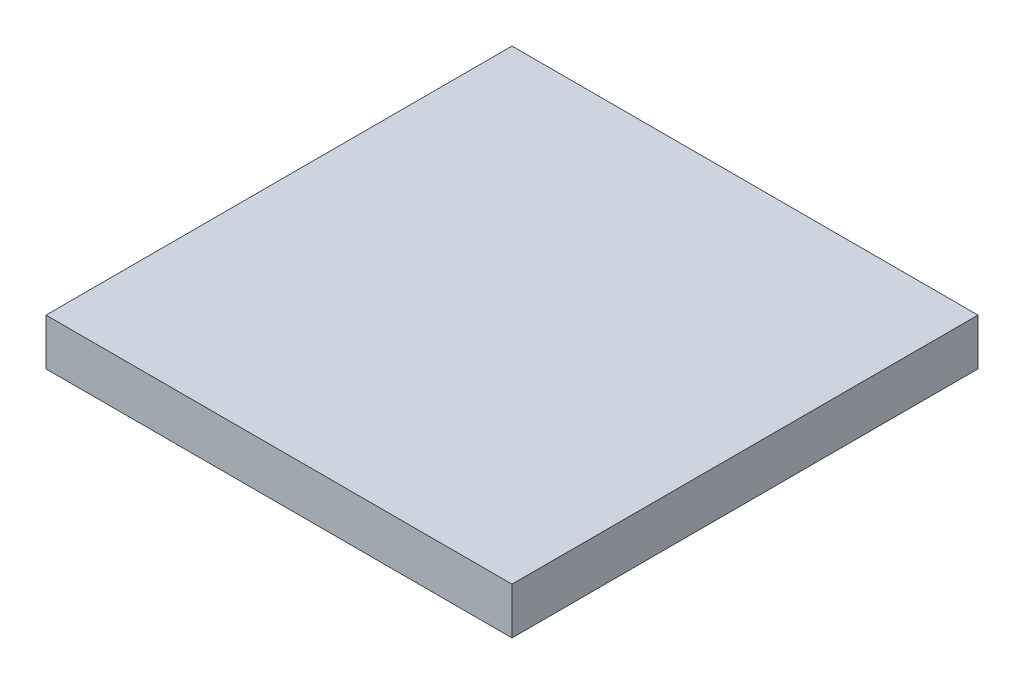
ISO-10303-21;
HEADER;
FILE_DESCRIPTION(('STEP AP214'),'2;1');
FILE_NAME('part.step','',(''),(''),'','','');
FILE_SCHEMA(('AUTOMOTIVE_DESIGN { 1 0 10303 214 1 1 1 1 }'));
ENDSEC;
DATA;
#1=APPLICATION_CONTEXT('core data for automotive mechanical design processes');
#2=APPLICATION_PROTOCOL_DEFINITION('international standard','automotive_design',2000,#1);
#3=PRODUCT_CONTEXT('',#1,'mechanical');
#4=PRODUCT('Part','Part','',(#3));
#5=PRODUCT_RELATED_PRODUCT_CATEGORY('part','',(#4));
#6=PRODUCT_DEFINITION_FORMATION('','',#4);
#7=PRODUCT_DEFINITION_CONTEXT('part definition',#1,'design');
#8=PRODUCT_DEFINITION('design','',#6,#7);
#9=PRODUCT_DEFINITION_SHAPE('','',#8);
#10=(LENGTH_UNIT() NAMED_UNIT(*) SI_UNIT(.MILLI.,.METRE.));
#11=(NAMED_UNIT(*) PLANE_ANGLE_UNIT() SI_UNIT($,.RADIAN.));
#12=(NAMED_UNIT(*) SI_UNIT($,.STERADIAN.) SOLID_ANGLE_UNIT());
#13=UNCERTAINTY_MEASURE_WITH_UNIT(LENGTH_MEASURE(1.E-05),#10,'distance_accuracy_value','');
#14=(GEOMETRIC_REPRESENTATION_CONTEXT(3) GLOBAL_UNCERTAINTY_ASSIGNED_CONTEXT((#13)) GLOBAL_UNIT_ASSIGNED_CONTEXT((#10,
#11,#12)) REPRESENTATION_CONTEXT('',''));
#15=CARTESIAN_POINT('',(0.,0.,0.));
#16=DIRECTION('',(0.,0.,1.));
#17=DIRECTION('',(1.,0.,0.));
#18=AXIS2_PLACEMENT_3D('',#15,#16,#17);
#19=CARTESIAN_POINT('',(-46.3511003257975,20.,-218.347310545628));
#20=DIRECTION('',(1.,0.,0.));
#21=DIRECTION('',(0.,0.,-1.));
#22=AXIS2_PLACEMENT_3D('',#19,#20,#21);
#23=PLANE('',#22);
#24=DIRECTION('',(0.,0.,1.));
#25=VECTOR('',#24,1.);
#26=CARTESIAN_POINT('',(-46.3511003257975,0.,-218.347310545628));
#27=LINE('',#26,#25);
#28=CARTESIAN_POINT('',(-46.3511003257975,0.,-218.347310545628));
#29=VERTEX_POINT('',#28);
#30=CARTESIAN_POINT('',(-46.3511003257975,0.,-18.3473105456282));
#31=VERTEX_POINT('',#30);
#32=EDGE_CURVE('E96',#29,#31,#27,.T.);
#33=ORIENTED_EDGE('',*,*,#32,.T.);
#34=DIRECTION('',(0.,-1.,0.));
#35=VECTOR('',#34,1.);
#36=CARTESIAN_POINT('',(-46.3511003257975,20.,-18.3473105456282));
#37=LINE('',#36,#35);
#38=CARTESIAN_POINT('',(-46.3511003257975,20.,-18.3473105456282));
#39=VERTEX_POINT('',#38);
#40=EDGE_CURVE('E11',#39,#31,#37,.T.);
#41=ORIENTED_EDGE('',*,*,#40,.F.);
#42=DIRECTION('',(0.,0.,1.));
#43=VECTOR('',#42,1.);
#44=CARTESIAN_POINT('',(-46.3511003257975,20.,-218.347310545628));
#45=LINE('',#44,#43);
#46=CARTESIAN_POINT('',(-46.3511003257975,20.,-218.347310545628));
#47=VERTEX_POINT('',#46);
#48=EDGE_CURVE('E84',#47,#39,#45,.T.);
#49=ORIENTED_EDGE('',*,*,#48,.F.);
#50=DIRECTION('',(0.,-1.,0.));
#51=VECTOR('',#50,1.);
#52=CARTESIAN_POINT('',(-46.3511003257975,20.,-218.347310545628));
#53=LINE('',#52,#51);
#54=EDGE_CURVE('E92',#47,#29,#53,.T.);
#55=ORIENTED_EDGE('',*,*,#54,.T.);
#56=EDGE_LOOP('',(#33,#41,#49,#55));
#57=FACE_BOUND('',#56,.T.);
#58=ADVANCED_FACE('F33',(#57),#23,.F.);
#59=CARTESIAN_POINT('',(-46.3511003257975,20.,-18.3473105456282));
#60=DIRECTION('',(0.,0.,-1.));
#61=DIRECTION('',(-1.,0.,0.));
#62=AXIS2_PLACEMENT_3D('',#59,#60,#61);
#63=PLANE('',#62);
#64=DIRECTION('',(1.,0.,0.));
#65=VECTOR('',#64,1.);
#66=CARTESIAN_POINT('',(-46.3511003257975,0.,-18.3473105456282));
#67=LINE('',#66,#65);
#68=CARTESIAN_POINT('',(153.648899674203,0.,-18.3473105456282));
#69=VERTEX_POINT('',#68);
#70=EDGE_CURVE('E88',#31,#69,#67,.T.);
#71=ORIENTED_EDGE('',*,*,#70,.T.);
#72=DIRECTION('',(0.,-1.,0.));
#73=VECTOR('',#72,1.);
#74=CARTESIAN_POINT('',(153.648899674203,20.,-18.3473105456282));
#75=LINE('',#74,#73);
#76=CARTESIAN_POINT('',(153.648899674203,20.,-18.3473105456282));
#77=VERTEX_POINT('',#76);
#78=EDGE_CURVE('E41',#77,#69,#75,.T.);
#79=ORIENTED_EDGE('',*,*,#78,.F.);
#80=DIRECTION('',(1.,0.,0.));
#81=VECTOR('',#80,1.);
#82=CARTESIAN_POINT('',(-46.3511003257975,20.,-18.3473105456282));
#83=LINE('',#82,#81);
#84=EDGE_CURVE('E79',#39,#77,#83,.T.);
#85=ORIENTED_EDGE('',*,*,#84,.F.);
#86=ORIENTED_EDGE('',*,*,#40,.T.);
#87=EDGE_LOOP('',(#71,#79,#85,#86));
#88=FACE_BOUND('',#87,.T.);
#89=ADVANCED_FACE('F87',(#88),#63,.F.);
#90=CARTESIAN_POINT('',(153.648899674203,20.,-218.347310545628));
#91=DIRECTION('',(-1.,0.,0.));
#92=DIRECTION('',(0.,0.,1.));
#93=AXIS2_PLACEMENT_3D('',#90,#91,#92);
#94=PLANE('',#93);
#95=DIRECTION('',(0.,0.,-1.));
#96=VECTOR('',#95,1.);
#97=CARTESIAN_POINT('',(153.648899674203,0.,-218.347310545628));
#98=LINE('',#97,#96);
#99=CARTESIAN_POINT('',(153.648899674203,0.,-218.347310545628));
#100=VERTEX_POINT('',#99);
#101=EDGE_CURVE('E66',#69,#100,#98,.T.);
#102=ORIENTED_EDGE('',*,*,#101,.T.);
#103=DIRECTION('',(0.,-1.,0.));
#104=VECTOR('',#103,1.);
#105=CARTESIAN_POINT('',(153.648899674203,20.,-218.347310545628));
#106=LINE('',#105,#104);
#107=CARTESIAN_POINT('',(153.648899674203,20.,-218.347310545628));
#108=VERTEX_POINT('',#107);
#109=EDGE_CURVE('E89',#108,#100,#106,.T.);
#110=ORIENTED_EDGE('',*,*,#109,.F.);
#111=DIRECTION('',(0.,0.,-1.));
#112=VECTOR('',#111,1.);
#113=CARTESIAN_POINT('',(153.648899674203,20.,-218.347310545628));
#114=LINE('',#113,#112);
#115=EDGE_CURVE('E82',#77,#108,#114,.T.);
#116=ORIENTED_EDGE('',*,*,#115,.F.);
#117=ORIENTED_EDGE('',*,*,#78,.T.);
#118=EDGE_LOOP('',(#102,#110,#116,#117));
#119=FACE_BOUND('',#118,.T.);
#120=ADVANCED_FACE('F90',(#119),#94,.F.);
#121=CARTESIAN_POINT('',(-46.3511003257975,20.,-218.347310545628));
#122=DIRECTION('',(0.,0.,1.));
#123=DIRECTION('',(1.,0.,0.));
#124=AXIS2_PLACEMENT_3D('',#121,#122,#123);
#125=PLANE('',#124);
#126=DIRECTION('',(-1.,0.,0.));
#127=VECTOR('',#126,1.);
#128=CARTESIAN_POINT('',(-46.3511003257975,0.,-218.347310545628));
#129=LINE('',#128,#127);
#130=EDGE_CURVE('E72',#100,#29,#129,.T.);
#131=ORIENTED_EDGE('',*,*,#130,.T.);
#132=ORIENTED_EDGE('',*,*,#54,.F.);
#133=DIRECTION('',(-1.,0.,0.));
#134=VECTOR('',#133,1.);
#135=CARTESIAN_POINT('',(-46.3511003257975,20.,-218.347310545628));
#136=LINE('',#135,#134);
#137=EDGE_CURVE('E49',#108,#47,#136,.T.);
#138=ORIENTED_EDGE('',*,*,#137,.F.);
#139=ORIENTED_EDGE('',*,*,#109,.T.);
#140=EDGE_LOOP('',(#131,#132,#138,#139));
#141=FACE_BOUND('',#140,.T.);
#142=ADVANCED_FACE('F103',(#141),#125,.F.);
#143=CARTESIAN_POINT('',(0.,20.,0.));
#144=DIRECTION('',(0.,1.,0.));
#145=DIRECTION('',(0.,0.,1.));
#146=AXIS2_PLACEMENT_3D('',#143,#144,#145);
#147=PLANE('',#146);
#148=ORIENTED_EDGE('',*,*,#48,.T.);
#149=ORIENTED_EDGE('',*,*,#84,.T.);
#150=ORIENTED_EDGE('',*,*,#115,.T.);
#151=ORIENTED_EDGE('',*,*,#137,.T.);
#152=EDGE_LOOP('',(#148,#149,#150,#151));
#153=FACE_BOUND('',#152,.T.);
#154=ADVANCED_FACE('F80',(#153),#147,.T.);
#155=CARTESIAN_POINT('',(0.,0.,0.));
#156=DIRECTION('',(0.,1.,0.));
#157=DIRECTION('',(0.,0.,1.));
#158=AXIS2_PLACEMENT_3D('',#155,#156,#157);
#159=PLANE('',#158);
#160=ORIENTED_EDGE('',*,*,#32,.F.);
#161=ORIENTED_EDGE('',*,*,#130,.F.);
#162=ORIENTED_EDGE('',*,*,#101,.F.);
#163=ORIENTED_EDGE('',*,*,#70,.F.);
#164=EDGE_LOOP('',(#160,#161,#162,#163));
#165=FACE_BOUND('',#164,.T.);
#166=ADVANCED_FACE('F106',(#165),#159,.F.);
#167=CLOSED_SHELL('',(#58,#89,#120,#142,#154,#166));
#168=MANIFOLD_SOLID_BREP('B2',#167);
#169=ADVANCED_BREP_SHAPE_REPRESENTATION('',(#18,#168),#14);
#170=SHAPE_DEFINITION_REPRESENTATION(#9,#169);
ENDSEC;
END-ISO-10303-21;
